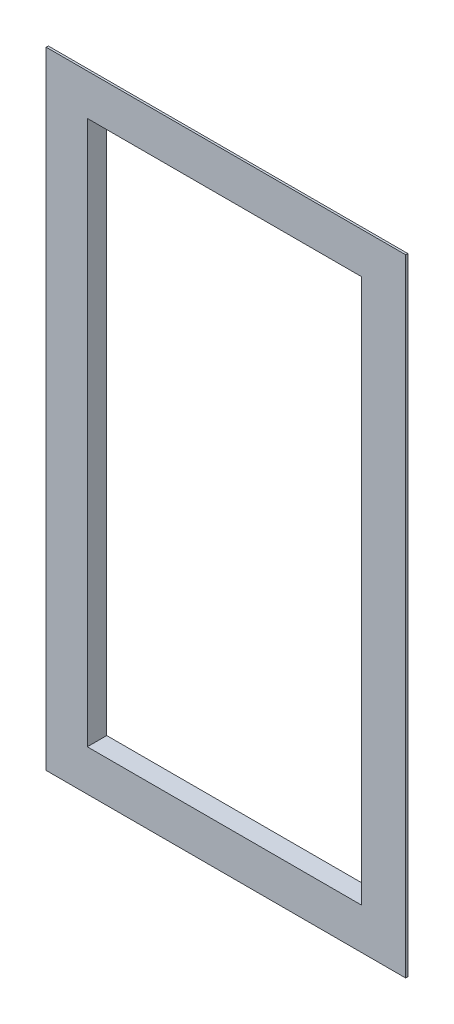
ISO-10303-21;
HEADER;
FILE_DESCRIPTION(('STEP AP214'),'2;1');
FILE_NAME('part.step','',(''),(''),'','','');
FILE_SCHEMA(('AUTOMOTIVE_DESIGN { 1 0 10303 214 1 1 1 1 }'));
ENDSEC;
DATA;
#1=APPLICATION_CONTEXT('core data for automotive mechanical design processes');
#2=APPLICATION_PROTOCOL_DEFINITION('international standard','automotive_design',2000,#1);
#3=PRODUCT_CONTEXT('',#1,'mechanical');
#4=PRODUCT('Part','Part','',(#3));
#5=PRODUCT_RELATED_PRODUCT_CATEGORY('part','',(#4));
#6=PRODUCT_DEFINITION_FORMATION('','',#4);
#7=PRODUCT_DEFINITION_CONTEXT('part definition',#1,'design');
#8=PRODUCT_DEFINITION('design','',#6,#7);
#9=PRODUCT_DEFINITION_SHAPE('','',#8);
#10=(LENGTH_UNIT() NAMED_UNIT(*) SI_UNIT(.MILLI.,.METRE.));
#11=(NAMED_UNIT(*) PLANE_ANGLE_UNIT() SI_UNIT($,.RADIAN.));
#12=(NAMED_UNIT(*) SI_UNIT($,.STERADIAN.) SOLID_ANGLE_UNIT());
#13=UNCERTAINTY_MEASURE_WITH_UNIT(LENGTH_MEASURE(1.E-05),#10,'distance_accuracy_value','');
#14=(GEOMETRIC_REPRESENTATION_CONTEXT(3) GLOBAL_UNCERTAINTY_ASSIGNED_CONTEXT((#13)) GLOBAL_UNIT_ASSIGNED_CONTEXT((#10,
#11,#12)) REPRESENTATION_CONTEXT('',''));
#15=CARTESIAN_POINT('',(0.,0.,0.));
#16=DIRECTION('',(0.,0.,1.));
#17=DIRECTION('',(1.,0.,0.));
#18=AXIS2_PLACEMENT_3D('',#15,#16,#17);
#19=CARTESIAN_POINT('',(0.,24.6202131013749,3.5));
#20=DIRECTION('',(0.,1.,0.));
#21=DIRECTION('',(0.,0.,1.));
#22=AXIS2_PLACEMENT_3D('',#19,#20,#21);
#23=PLANE('',#22);
#24=DIRECTION('',(0.,0.,-1.));
#25=VECTOR('',#24,1.);
#26=CARTESIAN_POINT('',(-48.8465027931278,24.6202131013749,3.5));
#27=LINE('',#26,#25);
#28=CARTESIAN_POINT('',(-48.8465027931278,24.6202131013749,3.5));
#29=VERTEX_POINT('',#28);
#30=CARTESIAN_POINT('',(-48.8465027931278,24.6202131013749,3.11660079715975));
#31=VERTEX_POINT('',#30);
#32=EDGE_CURVE('E138',#29,#31,#27,.T.);
#33=ORIENTED_EDGE('',*,*,#32,.T.);
#34=DIRECTION('',(1.,0.,0.));
#35=VECTOR('',#34,1.);
#36=CARTESIAN_POINT('',(0.,24.6202131013749,3.11660079715975));
#37=LINE('',#36,#35);
#38=CARTESIAN_POINT('',(15.8704783389477,24.6202131013749,3.11660079715975));
#39=VERTEX_POINT('',#38);
#40=EDGE_CURVE('E11',#31,#39,#37,.T.);
#41=ORIENTED_EDGE('',*,*,#40,.T.);
#42=DIRECTION('',(0.,0.,-1.));
#43=VECTOR('',#42,1.);
#44=CARTESIAN_POINT('',(15.8704783389477,24.6202131013749,3.5));
#45=LINE('',#44,#43);
#46=CARTESIAN_POINT('',(15.8704783389477,24.6202131013749,3.5));
#47=VERTEX_POINT('',#46);
#48=EDGE_CURVE('E169',#47,#39,#45,.T.);
#49=ORIENTED_EDGE('',*,*,#48,.F.);
#50=DIRECTION('',(1.,0.,0.));
#51=VECTOR('',#50,1.);
#52=CARTESIAN_POINT('',(0.,24.6202131013749,3.5));
#53=LINE('',#52,#51);
#54=EDGE_CURVE('E147',#29,#47,#53,.T.);
#55=ORIENTED_EDGE('',*,*,#54,.F.);
#56=EDGE_LOOP('',(#33,#41,#49,#55));
#57=FACE_BOUND('',#56,.T.);
#58=ADVANCED_FACE('F35',(#57),#23,.F.);
#59=CARTESIAN_POINT('',(15.8704783389477,0.,3.5));
#60=DIRECTION('',(1.,0.,0.));
#61=DIRECTION('',(0.,0.,-1.));
#62=AXIS2_PLACEMENT_3D('',#59,#60,#61);
#63=PLANE('',#62);
#64=ORIENTED_EDGE('',*,*,#48,.T.);
#65=DIRECTION('',(0.,1.,0.));
#66=VECTOR('',#65,1.);
#67=CARTESIAN_POINT('',(15.8704783389477,137.412665931564,3.11660079715975));
#68=LINE('',#67,#66);
#69=CARTESIAN_POINT('',(15.8704783389477,137.412665931564,3.11660079715975));
#70=VERTEX_POINT('',#69);
#71=EDGE_CURVE('E185',#39,#70,#68,.T.);
#72=ORIENTED_EDGE('',*,*,#71,.T.);
#73=DIRECTION('',(0.,0.,-1.));
#74=VECTOR('',#73,1.);
#75=CARTESIAN_POINT('',(15.8704783389477,137.412665931564,3.5));
#76=LINE('',#75,#74);
#77=CARTESIAN_POINT('',(15.8704783389477,137.412665931564,3.5));
#78=VERTEX_POINT('',#77);
#79=EDGE_CURVE('E167',#78,#70,#76,.T.);
#80=ORIENTED_EDGE('',*,*,#79,.F.);
#81=DIRECTION('',(0.,-1.,0.));
#82=VECTOR('',#81,1.);
#83=CARTESIAN_POINT('',(15.8704783389477,0.,3.5));
#84=LINE('',#83,#82);
#85=EDGE_CURVE('E149',#78,#47,#84,.T.);
#86=ORIENTED_EDGE('',*,*,#85,.T.);
#87=EDGE_LOOP('',(#64,#72,#80,#86));
#88=FACE_BOUND('',#87,.T.);
#89=ADVANCED_FACE('F214',(#88),#63,.T.);
#90=CARTESIAN_POINT('',(0.,137.412665931564,3.5));
#91=DIRECTION('',(0.,-1.,0.));
#92=DIRECTION('',(0.,0.,-1.));
#93=AXIS2_PLACEMENT_3D('',#90,#91,#92);
#94=PLANE('',#93);
#95=ORIENTED_EDGE('',*,*,#79,.T.);
#96=DIRECTION('',(-1.,0.,0.));
#97=VECTOR('',#96,1.);
#98=CARTESIAN_POINT('',(0.,137.412665931564,3.11660079715975));
#99=LINE('',#98,#97);
#100=CARTESIAN_POINT('',(-48.8465027931278,137.412665931564,3.11660079715975));
#101=VERTEX_POINT('',#100);
#102=EDGE_CURVE('E59',#70,#101,#99,.T.);
#103=ORIENTED_EDGE('',*,*,#102,.T.);
#104=DIRECTION('',(0.,0.,-1.));
#105=VECTOR('',#104,1.);
#106=CARTESIAN_POINT('',(-48.8465027931278,137.412665931564,3.5));
#107=LINE('',#106,#105);
#108=CARTESIAN_POINT('',(-48.8465027931278,137.412665931564,3.5));
#109=VERTEX_POINT('',#108);
#110=EDGE_CURVE('E165',#109,#101,#107,.T.);
#111=ORIENTED_EDGE('',*,*,#110,.F.);
#112=DIRECTION('',(-1.,0.,0.));
#113=VECTOR('',#112,1.);
#114=CARTESIAN_POINT('',(0.,137.412665931564,3.5));
#115=LINE('',#114,#113);
#116=EDGE_CURVE('E152',#78,#109,#115,.T.);
#117=ORIENTED_EDGE('',*,*,#116,.F.);
#118=EDGE_LOOP('',(#95,#103,#111,#117));
#119=FACE_BOUND('',#118,.T.);
#120=ADVANCED_FACE('F244',(#119),#94,.F.);
#121=CARTESIAN_POINT('',(0.,130.016439516469,3.5));
#122=DIRECTION('',(0.,1.,0.));
#123=DIRECTION('',(-1.,0.,0.));
#124=AXIS2_PLACEMENT_3D('',#121,#122,#123);
#125=PLANE('',#124);
#126=DIRECTION('',(1.,0.,0.));
#127=VECTOR('',#126,1.);
#128=CARTESIAN_POINT('',(0.,130.016439516469,0.));
#129=LINE('',#128,#127);
#130=CARTESIAN_POINT('',(-41.4502763780335,130.016439516469,0.));
#131=VERTEX_POINT('',#130);
#132=CARTESIAN_POINT('',(7.96257320084987,130.016439516469,0.));
#133=VERTEX_POINT('',#132);
#134=EDGE_CURVE('E134',#131,#133,#129,.T.);
#135=ORIENTED_EDGE('',*,*,#134,.T.);
#136=DIRECTION('',(0.,0.,-1.));
#137=VECTOR('',#136,1.);
#138=CARTESIAN_POINT('',(7.96257320084987,130.016439516469,3.5));
#139=LINE('',#138,#137);
#140=CARTESIAN_POINT('',(7.96257320084987,130.016439516469,3.5));
#141=VERTEX_POINT('',#140);
#142=EDGE_CURVE('E131',#141,#133,#139,.T.);
#143=ORIENTED_EDGE('',*,*,#142,.F.);
#144=DIRECTION('',(1.,0.,0.));
#145=VECTOR('',#144,1.);
#146=CARTESIAN_POINT('',(0.,130.016439516469,3.5));
#147=LINE('',#146,#145);
#148=CARTESIAN_POINT('',(-41.4502763780335,130.016439516469,3.5));
#149=VERTEX_POINT('',#148);
#150=EDGE_CURVE('E115',#149,#141,#147,.T.);
#151=ORIENTED_EDGE('',*,*,#150,.F.);
#152=DIRECTION('',(0.,0.,-1.));
#153=VECTOR('',#152,1.);
#154=CARTESIAN_POINT('',(-41.4502763780335,130.016439516469,3.5));
#155=LINE('',#154,#153);
#156=EDGE_CURVE('E156',#149,#131,#155,.T.);
#157=ORIENTED_EDGE('',*,*,#156,.T.);
#158=EDGE_LOOP('',(#135,#143,#151,#157));
#159=FACE_BOUND('',#158,.T.);
#160=ADVANCED_FACE('F132',(#159),#125,.F.);
#161=CARTESIAN_POINT('',(7.96257320084987,0.,3.5));
#162=DIRECTION('',(-1.,0.,0.));
#163=DIRECTION('',(0.,0.,1.));
#164=AXIS2_PLACEMENT_3D('',#161,#162,#163);
#165=PLANE('',#164);
#166=DIRECTION('',(0.,1.,0.));
#167=VECTOR('',#166,1.);
#168=CARTESIAN_POINT('',(7.96257320084987,0.,0.));
#169=LINE('',#168,#167);
#170=CARTESIAN_POINT('',(7.96257320084987,32.0164395164693,0.));
#171=VERTEX_POINT('',#170);
#172=EDGE_CURVE('E158',#171,#133,#169,.T.);
#173=ORIENTED_EDGE('',*,*,#172,.F.);
#174=DIRECTION('',(0.,0.,-1.));
#175=VECTOR('',#174,1.);
#176=CARTESIAN_POINT('',(7.96257320084987,32.0164395164693,3.5));
#177=LINE('',#176,#175);
#178=CARTESIAN_POINT('',(7.96257320084987,32.0164395164693,3.5));
#179=VERTEX_POINT('',#178);
#180=EDGE_CURVE('E139',#179,#171,#177,.T.);
#181=ORIENTED_EDGE('',*,*,#180,.F.);
#182=DIRECTION('',(0.,1.,0.));
#183=VECTOR('',#182,1.);
#184=CARTESIAN_POINT('',(7.96257320084987,0.,3.5));
#185=LINE('',#184,#183);
#186=EDGE_CURVE('E121',#179,#141,#185,.T.);
#187=ORIENTED_EDGE('',*,*,#186,.T.);
#188=ORIENTED_EDGE('',*,*,#142,.T.);
#189=EDGE_LOOP('',(#173,#181,#187,#188));
#190=FACE_BOUND('',#189,.T.);
#191=ADVANCED_FACE('F141',(#190),#165,.T.);
#192=CARTESIAN_POINT('',(0.,32.0164395164693,3.5));
#193=DIRECTION('',(0.,1.,0.));
#194=DIRECTION('',(0.,0.,1.));
#195=AXIS2_PLACEMENT_3D('',#192,#193,#194);
#196=PLANE('',#195);
#197=DIRECTION('',(1.,0.,0.));
#198=VECTOR('',#197,1.);
#199=CARTESIAN_POINT('',(0.,32.0164395164693,0.));
#200=LINE('',#199,#198);
#201=CARTESIAN_POINT('',(-41.4502763780335,32.0164395164693,0.));
#202=VERTEX_POINT('',#201);
#203=EDGE_CURVE('E160',#202,#171,#200,.T.);
#204=ORIENTED_EDGE('',*,*,#203,.F.);
#205=DIRECTION('',(0.,0.,-1.));
#206=VECTOR('',#205,1.);
#207=CARTESIAN_POINT('',(-41.4502763780335,32.0164395164693,3.5));
#208=LINE('',#207,#206);
#209=CARTESIAN_POINT('',(-41.4502763780335,32.0164395164693,3.5));
#210=VERTEX_POINT('',#209);
#211=EDGE_CURVE('E174',#210,#202,#208,.T.);
#212=ORIENTED_EDGE('',*,*,#211,.F.);
#213=DIRECTION('',(1.,0.,0.));
#214=VECTOR('',#213,1.);
#215=CARTESIAN_POINT('',(0.,32.0164395164693,3.5));
#216=LINE('',#215,#214);
#217=EDGE_CURVE('E142',#210,#179,#216,.T.);
#218=ORIENTED_EDGE('',*,*,#217,.T.);
#219=ORIENTED_EDGE('',*,*,#180,.T.);
#220=EDGE_LOOP('',(#204,#212,#218,#219));
#221=FACE_BOUND('',#220,.T.);
#222=ADVANCED_FACE('F227',(#221),#196,.T.);
#223=CARTESIAN_POINT('',(-41.4502763780335,0.,3.5));
#224=DIRECTION('',(-1.,0.,0.));
#225=DIRECTION('',(0.,0.,1.));
#226=AXIS2_PLACEMENT_3D('',#223,#224,#225);
#227=PLANE('',#226);
#228=DIRECTION('',(0.,1.,0.));
#229=VECTOR('',#228,1.);
#230=CARTESIAN_POINT('',(-41.4502763780335,0.,0.));
#231=LINE('',#230,#229);
#232=EDGE_CURVE('E128',#202,#131,#231,.T.);
#233=ORIENTED_EDGE('',*,*,#232,.T.);
#234=ORIENTED_EDGE('',*,*,#156,.F.);
#235=DIRECTION('',(0.,1.,0.));
#236=VECTOR('',#235,1.);
#237=CARTESIAN_POINT('',(-41.4502763780335,0.,3.5));
#238=LINE('',#237,#236);
#239=EDGE_CURVE('E124',#210,#149,#238,.T.);
#240=ORIENTED_EDGE('',*,*,#239,.F.);
#241=ORIENTED_EDGE('',*,*,#211,.T.);
#242=EDGE_LOOP('',(#233,#234,#240,#241));
#243=FACE_BOUND('',#242,.T.);
#244=ADVANCED_FACE('F229',(#243),#227,.F.);
#245=CARTESIAN_POINT('',(-48.8465027931278,0.,3.5));
#246=DIRECTION('',(1.,0.,0.));
#247=DIRECTION('',(0.,0.,-1.));
#248=AXIS2_PLACEMENT_3D('',#245,#246,#247);
#249=PLANE('',#248);
#250=ORIENTED_EDGE('',*,*,#110,.T.);
#251=DIRECTION('',(0.,-1.,0.));
#252=VECTOR('',#251,1.);
#253=CARTESIAN_POINT('',(-48.8465027931278,0.,3.11660079715975));
#254=LINE('',#253,#252);
#255=EDGE_CURVE('E44',#101,#31,#254,.T.);
#256=ORIENTED_EDGE('',*,*,#255,.T.);
#257=ORIENTED_EDGE('',*,*,#32,.F.);
#258=DIRECTION('',(0.,-1.,0.));
#259=VECTOR('',#258,1.);
#260=CARTESIAN_POINT('',(-48.8465027931278,0.,3.5));
#261=LINE('',#260,#259);
#262=EDGE_CURVE('E154',#109,#29,#261,.T.);
#263=ORIENTED_EDGE('',*,*,#262,.F.);
#264=EDGE_LOOP('',(#250,#256,#257,#263));
#265=FACE_BOUND('',#264,.T.);
#266=ADVANCED_FACE('F231',(#265),#249,.F.);
#267=CARTESIAN_POINT('',(0.,0.,3.5));
#268=DIRECTION('',(0.,0.,1.));
#269=DIRECTION('',(1.,0.,0.));
#270=AXIS2_PLACEMENT_3D('',#267,#268,#269);
#271=PLANE('',#270);
#272=ORIENTED_EDGE('',*,*,#150,.T.);
#273=ORIENTED_EDGE('',*,*,#186,.F.);
#274=ORIENTED_EDGE('',*,*,#217,.F.);
#275=ORIENTED_EDGE('',*,*,#239,.T.);
#276=EDGE_LOOP('',(#272,#273,#274,#275));
#277=FACE_BOUND('',#276,.T.);
#278=ORIENTED_EDGE('',*,*,#54,.T.);
#279=ORIENTED_EDGE('',*,*,#85,.F.);
#280=ORIENTED_EDGE('',*,*,#116,.T.);
#281=ORIENTED_EDGE('',*,*,#262,.T.);
#282=EDGE_LOOP('',(#278,#279,#280,#281));
#283=FACE_BOUND('',#282,.T.);
#284=ADVANCED_FACE('F117',(#277,#283),#271,.T.);
#285=CARTESIAN_POINT('',(0.,0.,0.));
#286=DIRECTION('',(0.,0.,1.));
#287=DIRECTION('',(1.,0.,0.));
#288=AXIS2_PLACEMENT_3D('',#285,#286,#287);
#289=PLANE('',#288);
#290=DIRECTION('',(1.,0.,0.));
#291=VECTOR('',#290,1.);
#292=CARTESIAN_POINT('',(0.,130.412665931564,0.));
#293=LINE('',#292,#291);
#294=CARTESIAN_POINT('',(-41.8465027931278,130.412665931564,0.));
#295=VERTEX_POINT('',#294);
#296=CARTESIAN_POINT('',(8.8704783389476,130.412665931564,0.));
#297=VERTEX_POINT('',#296);
#298=EDGE_CURVE('E180',#295,#297,#293,.T.);
#299=ORIENTED_EDGE('',*,*,#298,.T.);
#300=DIRECTION('',(0.,-1.,0.));
#301=VECTOR('',#300,1.);
#302=CARTESIAN_POINT('',(8.8704783389476,24.6202131013749,0.));
#303=LINE('',#302,#301);
#304=CARTESIAN_POINT('',(8.8704783389476,31.620213101375,0.));
#305=VERTEX_POINT('',#304);
#306=EDGE_CURVE('E182',#297,#305,#303,.T.);
#307=ORIENTED_EDGE('',*,*,#306,.T.);
#308=DIRECTION('',(-1.,0.,0.));
#309=VECTOR('',#308,1.);
#310=CARTESIAN_POINT('',(0.,31.620213101375,0.));
#311=LINE('',#310,#309);
#312=CARTESIAN_POINT('',(-41.8465027931278,31.620213101375,0.));
#313=VERTEX_POINT('',#312);
#314=EDGE_CURVE('E172',#305,#313,#311,.T.);
#315=ORIENTED_EDGE('',*,*,#314,.T.);
#316=DIRECTION('',(0.,1.,0.));
#317=VECTOR('',#316,1.);
#318=CARTESIAN_POINT('',(-41.8465027931278,0.,0.));
#319=LINE('',#318,#317);
#320=EDGE_CURVE('E178',#313,#295,#319,.T.);
#321=ORIENTED_EDGE('',*,*,#320,.T.);
#322=EDGE_LOOP('',(#299,#307,#315,#321));
#323=FACE_BOUND('',#322,.T.);
#324=ORIENTED_EDGE('',*,*,#134,.F.);
#325=ORIENTED_EDGE('',*,*,#232,.F.);
#326=ORIENTED_EDGE('',*,*,#203,.T.);
#327=ORIENTED_EDGE('',*,*,#172,.T.);
#328=EDGE_LOOP('',(#324,#325,#326,#327));
#329=FACE_BOUND('',#328,.T.);
#330=ADVANCED_FACE('F220',(#323,#329),#289,.F.);
#331=CARTESIAN_POINT('',(-48.8465027931278,0.,3.11660079715975));
#332=DIRECTION('',(0.406736643075798,0.,0.913545457642602));
#333=DIRECTION('',(0.,-1.,0.));
#334=AXIS2_PLACEMENT_3D('',#331,#332,#333);
#335=PLANE('',#334);
#336=DIRECTION('',(0.674471455947178,0.674471455947178,-0.300294039609494));
#337=VECTOR('',#336,1.);
#338=CARTESIAN_POINT('',(-26.6256549758536,46.8410609186491,-6.77675806296623));
#339=LINE('',#338,#337);
#340=EDGE_CURVE('E193',#31,#313,#339,.T.);
#341=ORIENTED_EDGE('',*,*,#340,.F.);
#342=ORIENTED_EDGE('',*,*,#255,.F.);
#343=DIRECTION('',(0.674471455947177,-0.674471455947178,-0.300294039609494));
#344=VECTOR('',#343,1.);
#345=CARTESIAN_POINT('',(13.6641328354437,74.902030302992,-24.7149273215499));
#346=LINE('',#345,#344);
#347=EDGE_CURVE('E39',#295,#101,#346,.F.);
#348=ORIENTED_EDGE('',*,*,#347,.F.);
#349=ORIENTED_EDGE('',*,*,#320,.F.);
#350=EDGE_LOOP('',(#341,#342,#348,#349));
#351=FACE_BOUND('',#350,.T.);
#352=ADVANCED_FACE('F37',(#351),#335,.F.);
#353=CARTESIAN_POINT('',(0.,137.412665931564,3.11660079715975));
#354=DIRECTION('',(0.,-0.406736643075797,0.913545457642602));
#355=DIRECTION('',(-1.,0.,0.));
#356=AXIS2_PLACEMENT_3D('',#353,#354,#355);
#357=PLANE('',#356);
#358=ORIENTED_EDGE('',*,*,#347,.T.);
#359=ORIENTED_EDGE('',*,*,#102,.F.);
#360=DIRECTION('',(0.674471455947177,0.674471455947178,0.300294039609494));
#361=VECTOR('',#360,1.);
#362=CARTESIAN_POINT('',(8.65081134557762,130.192998938194,-0.0978020466637945));
#363=LINE('',#362,#361);
#364=EDGE_CURVE('E192',#297,#70,#363,.T.);
#365=ORIENTED_EDGE('',*,*,#364,.F.);
#366=ORIENTED_EDGE('',*,*,#298,.F.);
#367=EDGE_LOOP('',(#358,#359,#365,#366));
#368=FACE_BOUND('',#367,.T.);
#369=ADVANCED_FACE('F203',(#368),#357,.F.);
#370=CARTESIAN_POINT('',(0.,24.6202131013749,3.11660079715975));
#371=DIRECTION('',(0.,0.406736643075798,0.913545457642602));
#372=DIRECTION('',(1.,0.,0.));
#373=AXIS2_PLACEMENT_3D('',#370,#371,#372);
#374=PLANE('',#373);
#375=ORIENTED_EDGE('',*,*,#340,.T.);
#376=ORIENTED_EDGE('',*,*,#314,.F.);
#377=DIRECTION('',(-0.674471455947178,0.674471455947178,-0.300294039609494));
#378=VECTOR('',#377,1.);
#379=CARTESIAN_POINT('',(8.65081134557762,31.839880094745,-0.0978020466637993));
#380=LINE('',#379,#378);
#381=EDGE_CURVE('E190',#39,#305,#380,.T.);
#382=ORIENTED_EDGE('',*,*,#381,.F.);
#383=ORIENTED_EDGE('',*,*,#40,.F.);
#384=EDGE_LOOP('',(#375,#376,#382,#383));
#385=FACE_BOUND('',#384,.T.);
#386=ADVANCED_FACE('F208',(#385),#374,.F.);
#387=CARTESIAN_POINT('',(8.8704783389476,0.,0.));
#388=DIRECTION('',(0.406736643075798,0.,-0.913545457642602));
#389=DIRECTION('',(0.,1.,0.));
#390=AXIS2_PLACEMENT_3D('',#387,#388,#389);
#391=PLANE('',#390);
#392=ORIENTED_EDGE('',*,*,#364,.T.);
#393=ORIENTED_EDGE('',*,*,#71,.F.);
#394=ORIENTED_EDGE('',*,*,#381,.T.);
#395=ORIENTED_EDGE('',*,*,#306,.F.);
#396=EDGE_LOOP('',(#392,#393,#394,#395));
#397=FACE_BOUND('',#396,.T.);
#398=ADVANCED_FACE('F217',(#397),#391,.T.);
#399=CLOSED_SHELL('',(#58,#89,#120,#160,#191,#222,#244,#266,#284,#330,#352,#369,#386,#398));
#400=MANIFOLD_SOLID_BREP('B2',#399);
#401=ADVANCED_BREP_SHAPE_REPRESENTATION('',(#18,#400),#14);
#402=SHAPE_DEFINITION_REPRESENTATION(#9,#401);
ENDSEC;
END-ISO-10303-21;
